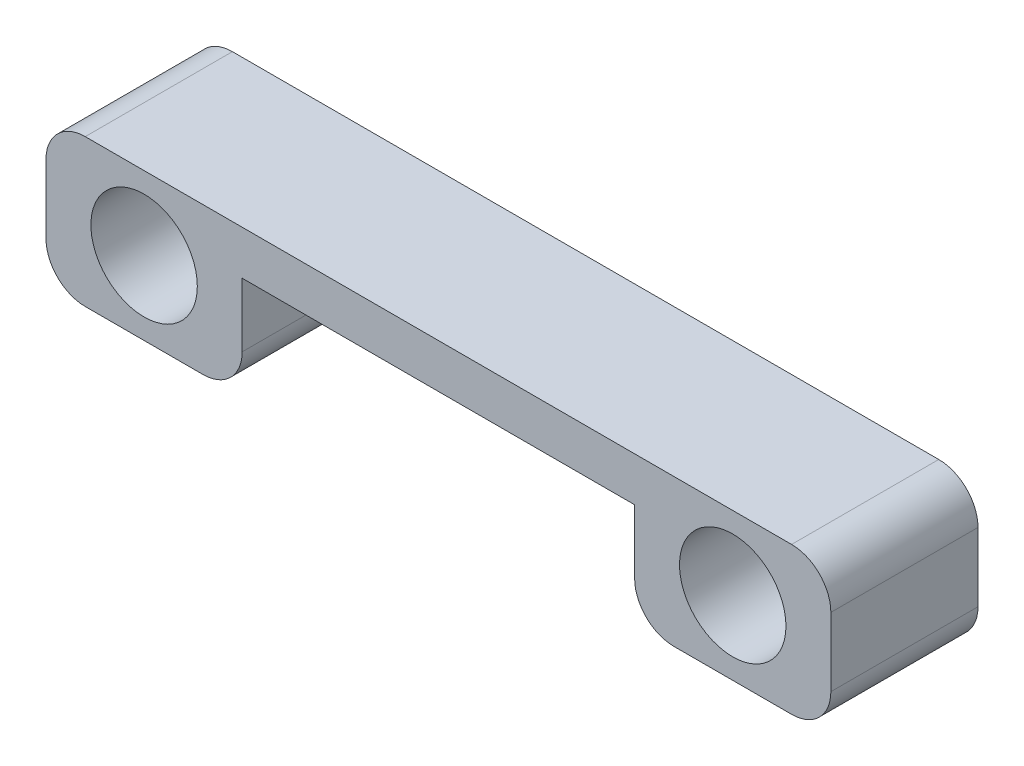
ISO-10303-21;
HEADER;
FILE_DESCRIPTION(('STEP AP214'),'2;1');
FILE_NAME('part.step','',(''),(''),'','','');
FILE_SCHEMA(('AUTOMOTIVE_DESIGN { 1 0 10303 214 1 1 1 1 }'));
ENDSEC;
DATA;
#1=APPLICATION_CONTEXT('core data for automotive mechanical design processes');
#2=APPLICATION_PROTOCOL_DEFINITION('international standard','automotive_design',2000,#1);
#3=PRODUCT_CONTEXT('',#1,'mechanical');
#4=PRODUCT('Part','Part','',(#3));
#5=PRODUCT_RELATED_PRODUCT_CATEGORY('part','',(#4));
#6=PRODUCT_DEFINITION_FORMATION('','',#4);
#7=PRODUCT_DEFINITION_CONTEXT('part definition',#1,'design');
#8=PRODUCT_DEFINITION('design','',#6,#7);
#9=PRODUCT_DEFINITION_SHAPE('','',#8);
#10=(LENGTH_UNIT() NAMED_UNIT(*) SI_UNIT(.MILLI.,.METRE.));
#11=(NAMED_UNIT(*) PLANE_ANGLE_UNIT() SI_UNIT($,.RADIAN.));
#12=(NAMED_UNIT(*) SI_UNIT($,.STERADIAN.) SOLID_ANGLE_UNIT());
#13=UNCERTAINTY_MEASURE_WITH_UNIT(LENGTH_MEASURE(1.E-05),#10,'distance_accuracy_value','');
#14=(GEOMETRIC_REPRESENTATION_CONTEXT(3) GLOBAL_UNCERTAINTY_ASSIGNED_CONTEXT((#13)) GLOBAL_UNIT_ASSIGNED_CONTEXT((#10,
#11,#12)) REPRESENTATION_CONTEXT('',''));
#15=CARTESIAN_POINT('',(0.,0.,0.));
#16=DIRECTION('',(0.,0.,1.));
#17=DIRECTION('',(1.,0.,0.));
#18=AXIS2_PLACEMENT_3D('',#15,#16,#17);
#19=CARTESIAN_POINT('',(8.,8.,30.));
#20=DIRECTION('',(0.,0.,-1.));
#21=DIRECTION('',(-1.,0.,0.));
#22=AXIS2_PLACEMENT_3D('',#19,#20,#21);
#23=CYLINDRICAL_SURFACE('',#22,8.);
#24=CARTESIAN_POINT('',(8.,8.,0.));
#25=DIRECTION('',(0.,0.,1.));
#26=DIRECTION('',(1.,0.,0.));
#27=AXIS2_PLACEMENT_3D('',#24,#25,#26);
#28=CIRCLE('',#27,8.);
#29=CARTESIAN_POINT('',(8.,0.,0.));
#30=VERTEX_POINT('',#29);
#31=CARTESIAN_POINT('',(0.,8.00000000000006,0.));
#32=VERTEX_POINT('',#31);
#33=EDGE_CURVE('E178',#30,#32,#28,.F.);
#34=ORIENTED_EDGE('',*,*,#33,.F.);
#35=DIRECTION('',(0.,0.,-1.));
#36=VECTOR('',#35,1.);
#37=CARTESIAN_POINT('',(8.,0.,30.));
#38=LINE('',#37,#36);
#39=CARTESIAN_POINT('',(8.,0.,30.));
#40=VERTEX_POINT('',#39);
#41=EDGE_CURVE('E11',#40,#30,#38,.T.);
#42=ORIENTED_EDGE('',*,*,#41,.F.);
#43=CARTESIAN_POINT('',(8.,8.,30.));
#44=DIRECTION('',(0.,0.,1.));
#45=DIRECTION('',(1.,0.,0.));
#46=AXIS2_PLACEMENT_3D('',#43,#44,#45);
#47=CIRCLE('',#46,8.);
#48=CARTESIAN_POINT('',(0.,8.00000000000006,30.));
#49=VERTEX_POINT('',#48);
#50=EDGE_CURVE('E218',#40,#49,#47,.F.);
#51=ORIENTED_EDGE('',*,*,#50,.T.);
#52=DIRECTION('',(0.,0.,-1.));
#53=VECTOR('',#52,1.);
#54=CARTESIAN_POINT('',(0.,8.00000000000006,30.));
#55=LINE('',#54,#53);
#56=EDGE_CURVE('E109',#49,#32,#55,.T.);
#57=ORIENTED_EDGE('',*,*,#56,.T.);
#58=EDGE_LOOP('',(#34,#42,#51,#57));
#59=FACE_BOUND('',#58,.T.);
#60=ADVANCED_FACE('F41',(#59),#23,.T.);
#61=CARTESIAN_POINT('',(0.,0.,30.));
#62=DIRECTION('',(0.,1.,0.));
#63=DIRECTION('',(0.,0.,1.));
#64=AXIS2_PLACEMENT_3D('',#61,#62,#63);
#65=PLANE('',#64);
#66=DIRECTION('',(1.,0.,0.));
#67=VECTOR('',#66,1.);
#68=CARTESIAN_POINT('',(0.,0.,0.));
#69=LINE('',#68,#67);
#70=CARTESIAN_POINT('',(32.,0.,0.));
#71=VERTEX_POINT('',#70);
#72=EDGE_CURVE('E181',#30,#71,#69,.T.);
#73=ORIENTED_EDGE('',*,*,#72,.T.);
#74=DIRECTION('',(0.,0.,-1.));
#75=VECTOR('',#74,1.);
#76=CARTESIAN_POINT('',(32.,0.,30.));
#77=LINE('',#76,#75);
#78=CARTESIAN_POINT('',(32.,0.,30.));
#79=VERTEX_POINT('',#78);
#80=EDGE_CURVE('E49',#79,#71,#77,.T.);
#81=ORIENTED_EDGE('',*,*,#80,.F.);
#82=DIRECTION('',(1.,0.,0.));
#83=VECTOR('',#82,1.);
#84=CARTESIAN_POINT('',(0.,0.,30.));
#85=LINE('',#84,#83);
#86=EDGE_CURVE('E311',#40,#79,#85,.T.);
#87=ORIENTED_EDGE('',*,*,#86,.F.);
#88=ORIENTED_EDGE('',*,*,#41,.T.);
#89=EDGE_LOOP('',(#73,#81,#87,#88));
#90=FACE_BOUND('',#89,.T.);
#91=ADVANCED_FACE('F306',(#90),#65,.F.);
#92=CARTESIAN_POINT('',(32.,8.,30.));
#93=DIRECTION('',(0.,0.,-1.));
#94=DIRECTION('',(-1.,0.,0.));
#95=AXIS2_PLACEMENT_3D('',#92,#93,#94);
#96=CYLINDRICAL_SURFACE('',#95,8.00000000000001);
#97=CARTESIAN_POINT('',(32.,8.,0.));
#98=DIRECTION('',(0.,0.,1.));
#99=DIRECTION('',(1.,0.,0.));
#100=AXIS2_PLACEMENT_3D('',#97,#98,#99);
#101=CIRCLE('',#100,8.00000000000001);
#102=CARTESIAN_POINT('',(40.,8.,0.));
#103=VERTEX_POINT('',#102);
#104=EDGE_CURVE('E183',#71,#103,#101,.T.);
#105=ORIENTED_EDGE('',*,*,#104,.T.);
#106=DIRECTION('',(0.,0.,-1.));
#107=VECTOR('',#106,1.);
#108=CARTESIAN_POINT('',(40.,8.,30.));
#109=LINE('',#108,#107);
#110=CARTESIAN_POINT('',(40.,8.,30.));
#111=VERTEX_POINT('',#110);
#112=EDGE_CURVE('E238',#111,#103,#109,.T.);
#113=ORIENTED_EDGE('',*,*,#112,.F.);
#114=CARTESIAN_POINT('',(32.,8.,30.));
#115=DIRECTION('',(0.,0.,1.));
#116=DIRECTION('',(1.,0.,0.));
#117=AXIS2_PLACEMENT_3D('',#114,#115,#116);
#118=CIRCLE('',#117,8.00000000000001);
#119=EDGE_CURVE('E247',#79,#111,#118,.T.);
#120=ORIENTED_EDGE('',*,*,#119,.F.);
#121=ORIENTED_EDGE('',*,*,#80,.T.);
#122=EDGE_LOOP('',(#105,#113,#120,#121));
#123=FACE_BOUND('',#122,.T.);
#124=ADVANCED_FACE('F245',(#123),#96,.T.);
#125=CARTESIAN_POINT('',(40.,0.,30.));
#126=DIRECTION('',(-1.,0.,0.));
#127=DIRECTION('',(0.,-1.,0.));
#128=AXIS2_PLACEMENT_3D('',#125,#126,#127);
#129=PLANE('',#128);
#130=DIRECTION('',(0.,1.,0.));
#131=VECTOR('',#130,1.);
#132=CARTESIAN_POINT('',(40.,0.,0.));
#133=LINE('',#132,#131);
#134=CARTESIAN_POINT('',(40.,21.,0.));
#135=VERTEX_POINT('',#134);
#136=EDGE_CURVE('E185',#103,#135,#133,.T.);
#137=ORIENTED_EDGE('',*,*,#136,.T.);
#138=DIRECTION('',(0.,0.,-1.));
#139=VECTOR('',#138,1.);
#140=CARTESIAN_POINT('',(40.,21.,30.));
#141=LINE('',#140,#139);
#142=CARTESIAN_POINT('',(40.,21.,30.));
#143=VERTEX_POINT('',#142);
#144=EDGE_CURVE('E235',#143,#135,#141,.T.);
#145=ORIENTED_EDGE('',*,*,#144,.F.);
#146=DIRECTION('',(0.,1.,0.));
#147=VECTOR('',#146,1.);
#148=CARTESIAN_POINT('',(40.,0.,30.));
#149=LINE('',#148,#147);
#150=EDGE_CURVE('E267',#111,#143,#149,.T.);
#151=ORIENTED_EDGE('',*,*,#150,.F.);
#152=ORIENTED_EDGE('',*,*,#112,.T.);
#153=EDGE_LOOP('',(#137,#145,#151,#152));
#154=FACE_BOUND('',#153,.T.);
#155=ADVANCED_FACE('F258',(#154),#129,.F.);
#156=CARTESIAN_POINT('',(0.,21.,30.));
#157=DIRECTION('',(0.,1.,0.));
#158=DIRECTION('',(-1.,0.,0.));
#159=AXIS2_PLACEMENT_3D('',#156,#157,#158);
#160=PLANE('',#159);
#161=DIRECTION('',(1.,0.,0.));
#162=VECTOR('',#161,1.);
#163=CARTESIAN_POINT('',(0.,21.,0.));
#164=LINE('',#163,#162);
#165=CARTESIAN_POINT('',(120.,21.,0.));
#166=VERTEX_POINT('',#165);
#167=EDGE_CURVE('E187',#135,#166,#164,.T.);
#168=ORIENTED_EDGE('',*,*,#167,.T.);
#169=DIRECTION('',(0.,0.,-1.));
#170=VECTOR('',#169,1.);
#171=CARTESIAN_POINT('',(120.,21.,30.));
#172=LINE('',#171,#170);
#173=CARTESIAN_POINT('',(120.,21.,30.));
#174=VERTEX_POINT('',#173);
#175=EDGE_CURVE('E232',#174,#166,#172,.T.);
#176=ORIENTED_EDGE('',*,*,#175,.F.);
#177=DIRECTION('',(1.,0.,0.));
#178=VECTOR('',#177,1.);
#179=CARTESIAN_POINT('',(0.,21.,30.));
#180=LINE('',#179,#178);
#181=EDGE_CURVE('E264',#143,#174,#180,.T.);
#182=ORIENTED_EDGE('',*,*,#181,.F.);
#183=ORIENTED_EDGE('',*,*,#144,.T.);
#184=EDGE_LOOP('',(#168,#176,#182,#183));
#185=FACE_BOUND('',#184,.T.);
#186=ADVANCED_FACE('F262',(#185),#160,.F.);
#187=CARTESIAN_POINT('',(120.,0.,30.));
#188=DIRECTION('',(1.,0.,0.));
#189=DIRECTION('',(0.,0.,-1.));
#190=AXIS2_PLACEMENT_3D('',#187,#188,#189);
#191=PLANE('',#190);
#192=DIRECTION('',(0.,-1.,0.));
#193=VECTOR('',#192,1.);
#194=CARTESIAN_POINT('',(120.,0.,0.));
#195=LINE('',#194,#193);
#196=CARTESIAN_POINT('',(120.,8.00000000000001,0.));
#197=VERTEX_POINT('',#196);
#198=EDGE_CURVE('E189',#166,#197,#195,.T.);
#199=ORIENTED_EDGE('',*,*,#198,.T.);
#200=DIRECTION('',(0.,0.,-1.));
#201=VECTOR('',#200,1.);
#202=CARTESIAN_POINT('',(120.,8.00000000000001,30.));
#203=LINE('',#202,#201);
#204=CARTESIAN_POINT('',(120.,8.00000000000001,30.));
#205=VERTEX_POINT('',#204);
#206=EDGE_CURVE('E230',#205,#197,#203,.T.);
#207=ORIENTED_EDGE('',*,*,#206,.F.);
#208=DIRECTION('',(0.,-1.,0.));
#209=VECTOR('',#208,1.);
#210=CARTESIAN_POINT('',(120.,0.,30.));
#211=LINE('',#210,#209);
#212=EDGE_CURVE('E266',#174,#205,#211,.T.);
#213=ORIENTED_EDGE('',*,*,#212,.F.);
#214=ORIENTED_EDGE('',*,*,#175,.T.);
#215=EDGE_LOOP('',(#199,#207,#213,#214));
#216=FACE_BOUND('',#215,.T.);
#217=ADVANCED_FACE('F417',(#216),#191,.F.);
#218=CARTESIAN_POINT('',(128.,8.00000000000001,30.));
#219=DIRECTION('',(0.,0.,-1.));
#220=DIRECTION('',(-1.,0.,0.));
#221=AXIS2_PLACEMENT_3D('',#218,#219,#220);
#222=CYLINDRICAL_SURFACE('',#221,8.);
#223=CARTESIAN_POINT('',(128.,8.00000000000001,0.));
#224=DIRECTION('',(0.,0.,1.));
#225=DIRECTION('',(1.,0.,0.));
#226=AXIS2_PLACEMENT_3D('',#223,#224,#225);
#227=CIRCLE('',#226,8.);
#228=CARTESIAN_POINT('',(128.,0.,0.));
#229=VERTEX_POINT('',#228);
#230=EDGE_CURVE('E192',#229,#197,#227,.F.);
#231=ORIENTED_EDGE('',*,*,#230,.F.);
#232=DIRECTION('',(0.,0.,-1.));
#233=VECTOR('',#232,1.);
#234=CARTESIAN_POINT('',(128.,0.,30.));
#235=LINE('',#234,#233);
#236=CARTESIAN_POINT('',(128.,0.,30.));
#237=VERTEX_POINT('',#236);
#238=EDGE_CURVE('E228',#237,#229,#235,.T.);
#239=ORIENTED_EDGE('',*,*,#238,.F.);
#240=CARTESIAN_POINT('',(128.,8.00000000000001,30.));
#241=DIRECTION('',(0.,0.,1.));
#242=DIRECTION('',(1.,0.,0.));
#243=AXIS2_PLACEMENT_3D('',#240,#241,#242);
#244=CIRCLE('',#243,8.);
#245=EDGE_CURVE('E269',#237,#205,#244,.F.);
#246=ORIENTED_EDGE('',*,*,#245,.T.);
#247=ORIENTED_EDGE('',*,*,#206,.T.);
#248=EDGE_LOOP('',(#231,#239,#246,#247));
#249=FACE_BOUND('',#248,.T.);
#250=ADVANCED_FACE('F408',(#249),#222,.T.);
#251=CARTESIAN_POINT('',(0.,0.,30.));
#252=DIRECTION('',(0.,-1.,0.));
#253=DIRECTION('',(1.,0.,0.));
#254=AXIS2_PLACEMENT_3D('',#251,#252,#253);
#255=PLANE('',#254);
#256=DIRECTION('',(-1.,0.,0.));
#257=VECTOR('',#256,1.);
#258=CARTESIAN_POINT('',(0.,0.,0.));
#259=LINE('',#258,#257);
#260=CARTESIAN_POINT('',(152.,0.,0.));
#261=VERTEX_POINT('',#260);
#262=EDGE_CURVE('E195',#261,#229,#259,.T.);
#263=ORIENTED_EDGE('',*,*,#262,.F.);
#264=DIRECTION('',(0.,0.,-1.));
#265=VECTOR('',#264,1.);
#266=CARTESIAN_POINT('',(152.,0.,30.));
#267=LINE('',#266,#265);
#268=CARTESIAN_POINT('',(152.,0.,30.));
#269=VERTEX_POINT('',#268);
#270=EDGE_CURVE('E226',#269,#261,#267,.T.);
#271=ORIENTED_EDGE('',*,*,#270,.F.);
#272=DIRECTION('',(-1.,0.,0.));
#273=VECTOR('',#272,1.);
#274=CARTESIAN_POINT('',(0.,0.,30.));
#275=LINE('',#274,#273);
#276=EDGE_CURVE('E276',#269,#237,#275,.T.);
#277=ORIENTED_EDGE('',*,*,#276,.T.);
#278=ORIENTED_EDGE('',*,*,#238,.T.);
#279=EDGE_LOOP('',(#263,#271,#277,#278));
#280=FACE_BOUND('',#279,.T.);
#281=ADVANCED_FACE('F400',(#280),#255,.T.);
#282=CARTESIAN_POINT('',(152.,8.00000000000002,30.));
#283=DIRECTION('',(0.,0.,-1.));
#284=DIRECTION('',(-1.,0.,0.));
#285=AXIS2_PLACEMENT_3D('',#282,#283,#284);
#286=CYLINDRICAL_SURFACE('',#285,8.);
#287=CARTESIAN_POINT('',(152.,8.00000000000002,0.));
#288=DIRECTION('',(0.,0.,1.));
#289=DIRECTION('',(1.,0.,0.));
#290=AXIS2_PLACEMENT_3D('',#287,#288,#289);
#291=CIRCLE('',#290,8.);
#292=CARTESIAN_POINT('',(160.,8.00000000000007,0.));
#293=VERTEX_POINT('',#292);
#294=EDGE_CURVE('E198',#261,#293,#291,.T.);
#295=ORIENTED_EDGE('',*,*,#294,.T.);
#296=DIRECTION('',(0.,0.,-1.));
#297=VECTOR('',#296,1.);
#298=CARTESIAN_POINT('',(160.,8.00000000000007,30.));
#299=LINE('',#298,#297);
#300=CARTESIAN_POINT('',(160.,8.00000000000007,30.));
#301=VERTEX_POINT('',#300);
#302=EDGE_CURVE('E224',#301,#293,#299,.T.);
#303=ORIENTED_EDGE('',*,*,#302,.F.);
#304=CARTESIAN_POINT('',(152.,8.00000000000002,30.));
#305=DIRECTION('',(0.,0.,1.));
#306=DIRECTION('',(1.,0.,0.));
#307=AXIS2_PLACEMENT_3D('',#304,#305,#306);
#308=CIRCLE('',#307,8.);
#309=EDGE_CURVE('E279',#269,#301,#308,.T.);
#310=ORIENTED_EDGE('',*,*,#309,.F.);
#311=ORIENTED_EDGE('',*,*,#270,.T.);
#312=EDGE_LOOP('',(#295,#303,#310,#311));
#313=FACE_BOUND('',#312,.T.);
#314=ADVANCED_FACE('F291',(#313),#286,.T.);
#315=CARTESIAN_POINT('',(160.,0.,30.));
#316=DIRECTION('',(1.,0.,0.));
#317=DIRECTION('',(0.,0.,-1.));
#318=AXIS2_PLACEMENT_3D('',#315,#316,#317);
#319=PLANE('',#318);
#320=DIRECTION('',(0.,-1.,0.));
#321=VECTOR('',#320,1.);
#322=CARTESIAN_POINT('',(160.,0.,0.));
#323=LINE('',#322,#321);
#324=CARTESIAN_POINT('',(160.,22.,0.));
#325=VERTEX_POINT('',#324);
#326=EDGE_CURVE('E201',#325,#293,#323,.T.);
#327=ORIENTED_EDGE('',*,*,#326,.F.);
#328=DIRECTION('',(0.,0.,-1.));
#329=VECTOR('',#328,1.);
#330=CARTESIAN_POINT('',(160.,22.,30.));
#331=LINE('',#330,#329);
#332=CARTESIAN_POINT('',(160.,22.,30.));
#333=VERTEX_POINT('',#332);
#334=EDGE_CURVE('E222',#333,#325,#331,.T.);
#335=ORIENTED_EDGE('',*,*,#334,.F.);
#336=DIRECTION('',(0.,-1.,0.));
#337=VECTOR('',#336,1.);
#338=CARTESIAN_POINT('',(160.,0.,30.));
#339=LINE('',#338,#337);
#340=EDGE_CURVE('E281',#333,#301,#339,.T.);
#341=ORIENTED_EDGE('',*,*,#340,.T.);
#342=ORIENTED_EDGE('',*,*,#302,.T.);
#343=EDGE_LOOP('',(#327,#335,#341,#342));
#344=FACE_BOUND('',#343,.T.);
#345=ADVANCED_FACE('F285',(#344),#319,.T.);
#346=CARTESIAN_POINT('',(152.,22.,30.));
#347=DIRECTION('',(0.,0.,-1.));
#348=DIRECTION('',(-1.,0.,0.));
#349=AXIS2_PLACEMENT_3D('',#346,#347,#348);
#350=CYLINDRICAL_SURFACE('',#349,7.99999999999999);
#351=CARTESIAN_POINT('',(152.,22.,0.));
#352=DIRECTION('',(0.,0.,1.));
#353=DIRECTION('',(1.,0.,0.));
#354=AXIS2_PLACEMENT_3D('',#351,#352,#353);
#355=CIRCLE('',#354,7.99999999999999);
#356=CARTESIAN_POINT('',(152.,30.,0.));
#357=VERTEX_POINT('',#356);
#358=EDGE_CURVE('E204',#325,#357,#355,.T.);
#359=ORIENTED_EDGE('',*,*,#358,.T.);
#360=DIRECTION('',(0.,0.,-1.));
#361=VECTOR('',#360,1.);
#362=CARTESIAN_POINT('',(152.,30.,30.));
#363=LINE('',#362,#361);
#364=CARTESIAN_POINT('',(152.,30.,30.));
#365=VERTEX_POINT('',#364);
#366=EDGE_CURVE('E157',#365,#357,#363,.T.);
#367=ORIENTED_EDGE('',*,*,#366,.F.);
#368=CARTESIAN_POINT('',(152.,22.,30.));
#369=DIRECTION('',(0.,0.,1.));
#370=DIRECTION('',(1.,0.,0.));
#371=AXIS2_PLACEMENT_3D('',#368,#369,#370);
#372=CIRCLE('',#371,7.99999999999999);
#373=EDGE_CURVE('E164',#333,#365,#372,.T.);
#374=ORIENTED_EDGE('',*,*,#373,.F.);
#375=ORIENTED_EDGE('',*,*,#334,.T.);
#376=EDGE_LOOP('',(#359,#367,#374,#375));
#377=FACE_BOUND('',#376,.T.);
#378=ADVANCED_FACE('F296',(#377),#350,.T.);
#379=CARTESIAN_POINT('',(0.,30.,30.));
#380=DIRECTION('',(0.,1.,0.));
#381=DIRECTION('',(0.,0.,1.));
#382=AXIS2_PLACEMENT_3D('',#379,#380,#381);
#383=PLANE('',#382);
#384=DIRECTION('',(1.,0.,0.));
#385=VECTOR('',#384,1.);
#386=CARTESIAN_POINT('',(0.,30.,0.));
#387=LINE('',#386,#385);
#388=CARTESIAN_POINT('',(8.,30.,0.));
#389=VERTEX_POINT('',#388);
#390=EDGE_CURVE('E152',#389,#357,#387,.T.);
#391=ORIENTED_EDGE('',*,*,#390,.F.);
#392=DIRECTION('',(0.,0.,-1.));
#393=VECTOR('',#392,1.);
#394=CARTESIAN_POINT('',(8.,30.,30.));
#395=LINE('',#394,#393);
#396=CARTESIAN_POINT('',(8.,30.,30.));
#397=VERTEX_POINT('',#396);
#398=EDGE_CURVE('E147',#397,#389,#395,.T.);
#399=ORIENTED_EDGE('',*,*,#398,.F.);
#400=DIRECTION('',(1.,0.,0.));
#401=VECTOR('',#400,1.);
#402=CARTESIAN_POINT('',(0.,30.,30.));
#403=LINE('',#402,#401);
#404=EDGE_CURVE('E150',#397,#365,#403,.T.);
#405=ORIENTED_EDGE('',*,*,#404,.T.);
#406=ORIENTED_EDGE('',*,*,#366,.T.);
#407=EDGE_LOOP('',(#391,#399,#405,#406));
#408=FACE_BOUND('',#407,.T.);
#409=ADVANCED_FACE('F149',(#408),#383,.T.);
#410=CARTESIAN_POINT('',(8.,22.,30.));
#411=DIRECTION('',(0.,0.,-1.));
#412=DIRECTION('',(-1.,0.,0.));
#413=AXIS2_PLACEMENT_3D('',#410,#411,#412);
#414=CYLINDRICAL_SURFACE('',#413,8.);
#415=CARTESIAN_POINT('',(8.,22.,0.));
#416=DIRECTION('',(0.,0.,1.));
#417=DIRECTION('',(1.,0.,0.));
#418=AXIS2_PLACEMENT_3D('',#415,#416,#417);
#419=CIRCLE('',#418,8.);
#420=CARTESIAN_POINT('',(0.,22.,0.));
#421=VERTEX_POINT('',#420);
#422=EDGE_CURVE('E208',#421,#389,#419,.F.);
#423=ORIENTED_EDGE('',*,*,#422,.F.);
#424=DIRECTION('',(0.,0.,-1.));
#425=VECTOR('',#424,1.);
#426=CARTESIAN_POINT('',(0.,22.,30.));
#427=LINE('',#426,#425);
#428=CARTESIAN_POINT('',(0.,22.,30.));
#429=VERTEX_POINT('',#428);
#430=EDGE_CURVE('E102',#429,#421,#427,.T.);
#431=ORIENTED_EDGE('',*,*,#430,.F.);
#432=CARTESIAN_POINT('',(8.,22.,30.));
#433=DIRECTION('',(0.,0.,1.));
#434=DIRECTION('',(1.,0.,0.));
#435=AXIS2_PLACEMENT_3D('',#432,#433,#434);
#436=CIRCLE('',#435,8.);
#437=EDGE_CURVE('E161',#429,#397,#436,.F.);
#438=ORIENTED_EDGE('',*,*,#437,.T.);
#439=ORIENTED_EDGE('',*,*,#398,.T.);
#440=EDGE_LOOP('',(#423,#431,#438,#439));
#441=FACE_BOUND('',#440,.T.);
#442=ADVANCED_FACE('F167',(#441),#414,.T.);
#443=CARTESIAN_POINT('',(20.,15.,30.));
#444=DIRECTION('',(0.,0.,-1.));
#445=DIRECTION('',(-1.,0.,0.));
#446=AXIS2_PLACEMENT_3D('',#443,#444,#445);
#447=CYLINDRICAL_SURFACE('',#446,10.85);
#448=CARTESIAN_POINT('',(20.,15.,30.));
#449=DIRECTION('',(0.,0.,1.));
#450=DIRECTION('',(1.,0.,0.));
#451=AXIS2_PLACEMENT_3D('',#448,#449,#450);
#452=CIRCLE('',#451,10.85);
#453=CARTESIAN_POINT('',(30.85,15.,30.));
#454=VERTEX_POINT('',#453);
#455=EDGE_CURVE('E169',#454,#454,#452,.T.);
#456=ORIENTED_EDGE('',*,*,#455,.T.);
#457=EDGE_LOOP('',(#456));
#458=FACE_BOUND('',#457,.T.);
#459=CARTESIAN_POINT('',(20.,15.,0.));
#460=DIRECTION('',(0.,0.,1.));
#461=DIRECTION('',(1.,0.,0.));
#462=AXIS2_PLACEMENT_3D('',#459,#460,#461);
#463=CIRCLE('',#462,10.85);
#464=CARTESIAN_POINT('',(30.85,15.,0.));
#465=VERTEX_POINT('',#464);
#466=EDGE_CURVE('E212',#465,#465,#463,.T.);
#467=ORIENTED_EDGE('',*,*,#466,.F.);
#468=EDGE_LOOP('',(#467));
#469=FACE_BOUND('',#468,.T.);
#470=ADVANCED_FACE('F316',(#458,#469),#447,.F.);
#471=CARTESIAN_POINT('',(0.,0.,30.));
#472=DIRECTION('',(1.,0.,0.));
#473=DIRECTION('',(0.,1.,0.));
#474=AXIS2_PLACEMENT_3D('',#471,#472,#473);
#475=PLANE('',#474);
#476=DIRECTION('',(0.,-1.,0.));
#477=VECTOR('',#476,1.);
#478=CARTESIAN_POINT('',(0.,0.,0.));
#479=LINE('',#478,#477);
#480=EDGE_CURVE('E210',#421,#32,#479,.T.);
#481=ORIENTED_EDGE('',*,*,#480,.T.);
#482=ORIENTED_EDGE('',*,*,#56,.F.);
#483=DIRECTION('',(0.,-1.,0.));
#484=VECTOR('',#483,1.);
#485=CARTESIAN_POINT('',(0.,0.,30.));
#486=LINE('',#485,#484);
#487=EDGE_CURVE('E57',#429,#49,#486,.T.);
#488=ORIENTED_EDGE('',*,*,#487,.F.);
#489=ORIENTED_EDGE('',*,*,#430,.T.);
#490=EDGE_LOOP('',(#481,#482,#488,#489));
#491=FACE_BOUND('',#490,.T.);
#492=ADVANCED_FACE('F310',(#491),#475,.F.);
#493=CARTESIAN_POINT('',(140.,15.,30.));
#494=DIRECTION('',(0.,0.,-1.));
#495=DIRECTION('',(-1.,0.,0.));
#496=AXIS2_PLACEMENT_3D('',#493,#494,#495);
#497=CYLINDRICAL_SURFACE('',#496,10.85);
#498=CARTESIAN_POINT('',(140.,15.,30.));
#499=DIRECTION('',(0.,0.,1.));
#500=DIRECTION('',(1.,0.,0.));
#501=AXIS2_PLACEMENT_3D('',#498,#499,#500);
#502=CIRCLE('',#501,10.85);
#503=CARTESIAN_POINT('',(150.85,15.,30.));
#504=VERTEX_POINT('',#503);
#505=EDGE_CURVE('E175',#504,#504,#502,.F.);
#506=ORIENTED_EDGE('',*,*,#505,.F.);
#507=EDGE_LOOP('',(#506));
#508=FACE_BOUND('',#507,.T.);
#509=CARTESIAN_POINT('',(140.,15.,0.));
#510=DIRECTION('',(0.,0.,1.));
#511=DIRECTION('',(1.,0.,0.));
#512=AXIS2_PLACEMENT_3D('',#509,#510,#511);
#513=CIRCLE('',#512,10.85);
#514=CARTESIAN_POINT('',(150.85,15.,0.));
#515=VERTEX_POINT('',#514);
#516=EDGE_CURVE('E215',#515,#515,#513,.F.);
#517=ORIENTED_EDGE('',*,*,#516,.T.);
#518=EDGE_LOOP('',(#517));
#519=FACE_BOUND('',#518,.T.);
#520=ADVANCED_FACE('F315',(#508,#519),#497,.F.);
#521=CARTESIAN_POINT('',(0.,0.,30.));
#522=DIRECTION('',(0.,0.,1.));
#523=DIRECTION('',(1.,0.,0.));
#524=AXIS2_PLACEMENT_3D('',#521,#522,#523);
#525=PLANE('',#524);
#526=ORIENTED_EDGE('',*,*,#50,.F.);
#527=ORIENTED_EDGE('',*,*,#86,.T.);
#528=ORIENTED_EDGE('',*,*,#119,.T.);
#529=ORIENTED_EDGE('',*,*,#150,.T.);
#530=ORIENTED_EDGE('',*,*,#181,.T.);
#531=ORIENTED_EDGE('',*,*,#212,.T.);
#532=ORIENTED_EDGE('',*,*,#245,.F.);
#533=ORIENTED_EDGE('',*,*,#276,.F.);
#534=ORIENTED_EDGE('',*,*,#309,.T.);
#535=ORIENTED_EDGE('',*,*,#340,.F.);
#536=ORIENTED_EDGE('',*,*,#373,.T.);
#537=ORIENTED_EDGE('',*,*,#404,.F.);
#538=ORIENTED_EDGE('',*,*,#437,.F.);
#539=ORIENTED_EDGE('',*,*,#487,.T.);
#540=EDGE_LOOP('',(#526,#527,#528,#529,#530,#531,#532,#533,#534,#535,#536,#537,#538,#539));
#541=FACE_BOUND('',#540,.T.);
#542=ORIENTED_EDGE('',*,*,#455,.F.);
#543=EDGE_LOOP('',(#542));
#544=FACE_BOUND('',#543,.T.);
#545=ORIENTED_EDGE('',*,*,#505,.T.);
#546=EDGE_LOOP('',(#545));
#547=FACE_BOUND('',#546,.T.);
#548=ADVANCED_FACE('F159',(#541,#544,#547),#525,.T.);
#549=CARTESIAN_POINT('',(0.,0.,0.));
#550=DIRECTION('',(0.,0.,1.));
#551=DIRECTION('',(1.,0.,0.));
#552=AXIS2_PLACEMENT_3D('',#549,#550,#551);
#553=PLANE('',#552);
#554=ORIENTED_EDGE('',*,*,#33,.T.);
#555=ORIENTED_EDGE('',*,*,#480,.F.);
#556=ORIENTED_EDGE('',*,*,#422,.T.);
#557=ORIENTED_EDGE('',*,*,#390,.T.);
#558=ORIENTED_EDGE('',*,*,#358,.F.);
#559=ORIENTED_EDGE('',*,*,#326,.T.);
#560=ORIENTED_EDGE('',*,*,#294,.F.);
#561=ORIENTED_EDGE('',*,*,#262,.T.);
#562=ORIENTED_EDGE('',*,*,#230,.T.);
#563=ORIENTED_EDGE('',*,*,#198,.F.);
#564=ORIENTED_EDGE('',*,*,#167,.F.);
#565=ORIENTED_EDGE('',*,*,#136,.F.);
#566=ORIENTED_EDGE('',*,*,#104,.F.);
#567=ORIENTED_EDGE('',*,*,#72,.F.);
#568=EDGE_LOOP('',(#554,#555,#556,#557,#558,#559,#560,#561,#562,#563,#564,#565,#566,#567));
#569=FACE_BOUND('',#568,.T.);
#570=ORIENTED_EDGE('',*,*,#466,.T.);
#571=EDGE_LOOP('',(#570));
#572=FACE_BOUND('',#571,.T.);
#573=ORIENTED_EDGE('',*,*,#516,.F.);
#574=EDGE_LOOP('',(#573));
#575=FACE_BOUND('',#574,.T.);
#576=ADVANCED_FACE('F252',(#569,#572,#575),#553,.F.);
#577=CLOSED_SHELL('',(#60,#91,#124,#155,#186,#217,#250,#281,#314,#345,#378,#409,#442,#470,#492,
#520,#548,#576));
#578=MANIFOLD_SOLID_BREP('B2',#577);
#579=ADVANCED_BREP_SHAPE_REPRESENTATION('',(#18,#578),#14);
#580=SHAPE_DEFINITION_REPRESENTATION(#9,#579);
ENDSEC;
END-ISO-10303-21;
